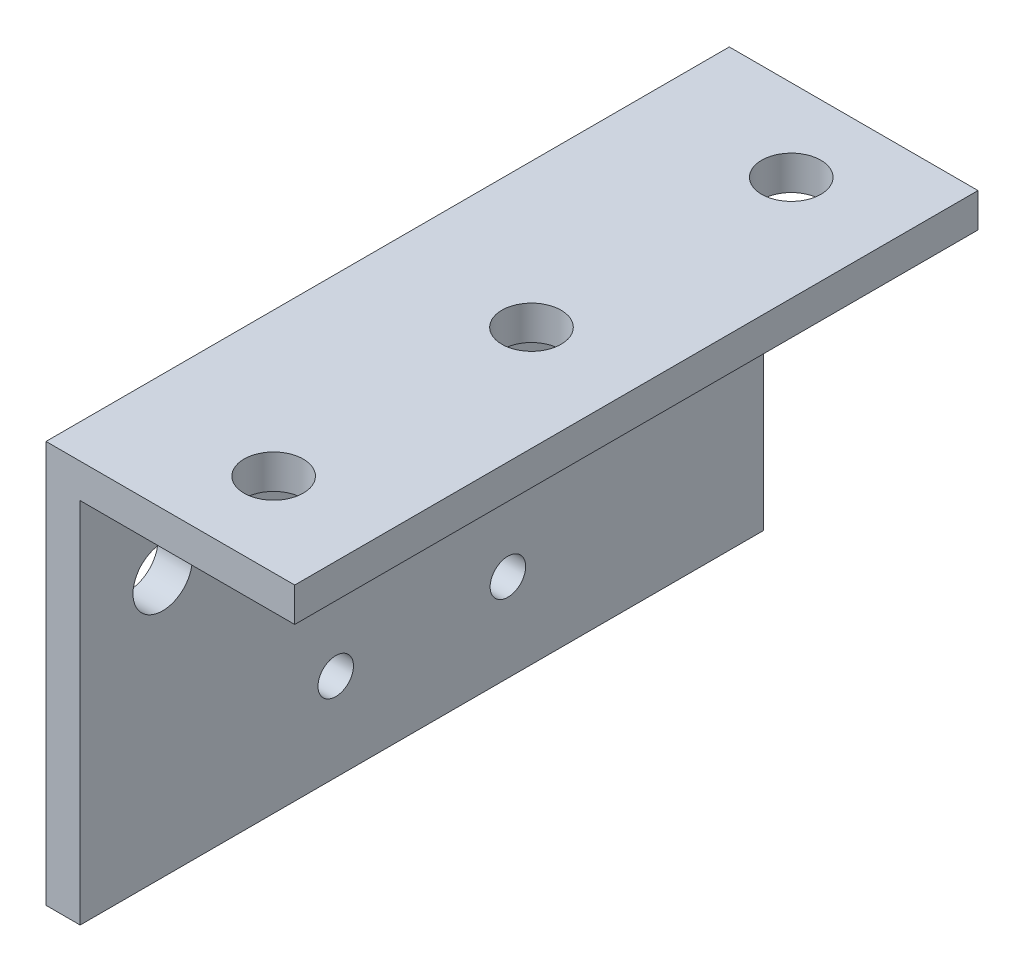
ISO-10303-21;
HEADER;
FILE_DESCRIPTION(('STEP AP214'),'2;1');
FILE_NAME('part.step','',(''),(''),'','','');
FILE_SCHEMA(('AUTOMOTIVE_DESIGN { 1 0 10303 214 1 1 1 1 }'));
ENDSEC;
DATA;
#1=APPLICATION_CONTEXT('core data for automotive mechanical design processes');
#2=APPLICATION_PROTOCOL_DEFINITION('international standard','automotive_design',2000,#1);
#3=PRODUCT_CONTEXT('',#1,'mechanical');
#4=PRODUCT('Part','Part','',(#3));
#5=PRODUCT_RELATED_PRODUCT_CATEGORY('part','',(#4));
#6=PRODUCT_DEFINITION_FORMATION('','',#4);
#7=PRODUCT_DEFINITION_CONTEXT('part definition',#1,'design');
#8=PRODUCT_DEFINITION('design','',#6,#7);
#9=PRODUCT_DEFINITION_SHAPE('','',#8);
#10=(LENGTH_UNIT() NAMED_UNIT(*) SI_UNIT(.MILLI.,.METRE.));
#11=(NAMED_UNIT(*) PLANE_ANGLE_UNIT() SI_UNIT($,.RADIAN.));
#12=(NAMED_UNIT(*) SI_UNIT($,.STERADIAN.) SOLID_ANGLE_UNIT());
#13=UNCERTAINTY_MEASURE_WITH_UNIT(LENGTH_MEASURE(1.E-05),#10,'distance_accuracy_value','');
#14=(GEOMETRIC_REPRESENTATION_CONTEXT(3) GLOBAL_UNCERTAINTY_ASSIGNED_CONTEXT((#13)) GLOBAL_UNIT_ASSIGNED_CONTEXT((#10,
#11,#12)) REPRESENTATION_CONTEXT('',''));
#15=CARTESIAN_POINT('',(0.,0.,0.));
#16=DIRECTION('',(0.,0.,1.));
#17=DIRECTION('',(1.,0.,0.));
#18=AXIS2_PLACEMENT_3D('',#15,#16,#17);
#19=CARTESIAN_POINT('',(0.,0.,63.5));
#20=DIRECTION('',(0.,1.,0.));
#21=DIRECTION('',(0.,0.,1.));
#22=AXIS2_PLACEMENT_3D('',#19,#20,#21);
#23=PLANE('',#22);
#24=DIRECTION('',(1.,0.,0.));
#25=VECTOR('',#24,1.);
#26=CARTESIAN_POINT('',(0.,0.,0.));
#27=LINE('',#26,#25);
#28=CARTESIAN_POINT('',(0.,0.,0.));
#29=VERTEX_POINT('',#28);
#30=CARTESIAN_POINT('',(3.175,0.,0.));
#31=VERTEX_POINT('',#30);
#32=EDGE_CURVE('E129',#29,#31,#27,.T.);
#33=ORIENTED_EDGE('',*,*,#32,.T.);
#34=DIRECTION('',(0.,0.,-1.));
#35=VECTOR('',#34,1.);
#36=CARTESIAN_POINT('',(3.175,0.,63.5));
#37=LINE('',#36,#35);
#38=CARTESIAN_POINT('',(3.175,0.,63.5));
#39=VERTEX_POINT('',#38);
#40=EDGE_CURVE('E11',#39,#31,#37,.T.);
#41=ORIENTED_EDGE('',*,*,#40,.F.);
#42=DIRECTION('',(1.,0.,0.));
#43=VECTOR('',#42,1.);
#44=CARTESIAN_POINT('',(0.,0.,63.5));
#45=LINE('',#44,#43);
#46=CARTESIAN_POINT('',(0.,0.,63.5));
#47=VERTEX_POINT('',#46);
#48=EDGE_CURVE('E140',#47,#39,#45,.T.);
#49=ORIENTED_EDGE('',*,*,#48,.F.);
#50=DIRECTION('',(0.,0.,-1.));
#51=VECTOR('',#50,1.);
#52=CARTESIAN_POINT('',(0.,0.,63.5));
#53=LINE('',#52,#51);
#54=EDGE_CURVE('E125',#47,#29,#53,.T.);
#55=ORIENTED_EDGE('',*,*,#54,.T.);
#56=EDGE_LOOP('',(#33,#41,#49,#55));
#57=FACE_BOUND('',#56,.T.);
#58=ADVANCED_FACE('F45',(#57),#23,.F.);
#59=CARTESIAN_POINT('',(3.175,0.,63.5));
#60=DIRECTION('',(-1.,0.,0.));
#61=DIRECTION('',(0.,0.,1.));
#62=AXIS2_PLACEMENT_3D('',#59,#60,#61);
#63=PLANE('',#62);
#64=CARTESIAN_POINT('',(3.175,24.163,23.75));
#65=DIRECTION('',(-1.,0.,0.));
#66=DIRECTION('',(0.,0.,1.));
#67=AXIS2_PLACEMENT_3D('',#64,#65,#66);
#68=CIRCLE('',#67,1.64999999999999);
#69=CARTESIAN_POINT('',(3.175,24.163,25.4));
#70=VERTEX_POINT('',#69);
#71=EDGE_CURVE('E298',#70,#70,#68,.T.);
#72=ORIENTED_EDGE('',*,*,#71,.T.);
#73=EDGE_LOOP('',(#72));
#74=FACE_BOUND('',#73,.T.);
#75=CARTESIAN_POINT('',(3.175,8.16299999999999,23.75));
#76=DIRECTION('',(-1.,0.,0.));
#77=DIRECTION('',(0.,0.,1.));
#78=AXIS2_PLACEMENT_3D('',#75,#76,#77);
#79=CIRCLE('',#78,1.64999999999999);
#80=CARTESIAN_POINT('',(3.175,8.16299999999999,25.4));
#81=VERTEX_POINT('',#80);
#82=EDGE_CURVE('E302',#81,#81,#79,.T.);
#83=ORIENTED_EDGE('',*,*,#82,.T.);
#84=EDGE_LOOP('',(#83));
#85=FACE_BOUND('',#84,.T.);
#86=CARTESIAN_POINT('',(3.175,8.16299999999999,39.75));
#87=DIRECTION('',(-1.,0.,0.));
#88=DIRECTION('',(0.,0.,1.));
#89=AXIS2_PLACEMENT_3D('',#86,#87,#88);
#90=CIRCLE('',#89,1.64999999999999);
#91=CARTESIAN_POINT('',(3.175,8.16299999999999,41.4));
#92=VERTEX_POINT('',#91);
#93=EDGE_CURVE('E311',#92,#92,#90,.T.);
#94=ORIENTED_EDGE('',*,*,#93,.T.);
#95=EDGE_LOOP('',(#94));
#96=FACE_BOUND('',#95,.T.);
#97=CARTESIAN_POINT('',(3.175,24.163,39.75));
#98=DIRECTION('',(-1.,0.,0.));
#99=DIRECTION('',(0.,0.,1.));
#100=AXIS2_PLACEMENT_3D('',#97,#98,#99);
#101=CIRCLE('',#100,1.64999999999999);
#102=CARTESIAN_POINT('',(3.175,24.163,41.4));
#103=VERTEX_POINT('',#102);
#104=EDGE_CURVE('E317',#103,#103,#101,.T.);
#105=ORIENTED_EDGE('',*,*,#104,.T.);
#106=EDGE_LOOP('',(#105));
#107=FACE_BOUND('',#106,.T.);
#108=CARTESIAN_POINT('',(3.175,24.2082215193958,7.6776384833819));
#109=DIRECTION('',(-1.,0.,0.));
#110=DIRECTION('',(0.,0.,1.));
#111=AXIS2_PLACEMENT_3D('',#108,#109,#110);
#112=CIRCLE('',#111,2.75);
#113=CARTESIAN_POINT('',(3.175,24.2082215193958,10.4276384833819));
#114=VERTEX_POINT('',#113);
#115=EDGE_CURVE('E341',#114,#114,#112,.T.);
#116=ORIENTED_EDGE('',*,*,#115,.T.);
#117=EDGE_LOOP('',(#116));
#118=FACE_BOUND('',#117,.T.);
#119=CARTESIAN_POINT('',(3.175,24.2082215193958,55.8413474799005));
#120=DIRECTION('',(-1.,0.,0.));
#121=DIRECTION('',(0.,0.,1.));
#122=AXIS2_PLACEMENT_3D('',#119,#120,#121);
#123=CIRCLE('',#122,2.75);
#124=CARTESIAN_POINT('',(3.175,24.2082215193958,58.5913474799005));
#125=VERTEX_POINT('',#124);
#126=EDGE_CURVE('E133',#125,#125,#123,.T.);
#127=ORIENTED_EDGE('',*,*,#126,.T.);
#128=EDGE_LOOP('',(#127));
#129=FACE_BOUND('',#128,.T.);
#130=DIRECTION('',(0.,1.,0.));
#131=VECTOR('',#130,1.);
#132=CARTESIAN_POINT('',(3.175,0.,0.));
#133=LINE('',#132,#131);
#134=CARTESIAN_POINT('',(3.175,34.163,0.));
#135=VERTEX_POINT('',#134);
#136=EDGE_CURVE('E132',#31,#135,#133,.T.);
#137=ORIENTED_EDGE('',*,*,#136,.T.);
#138=DIRECTION('',(0.,0.,-1.));
#139=VECTOR('',#138,1.);
#140=CARTESIAN_POINT('',(3.175,34.163,63.5));
#141=LINE('',#140,#139);
#142=CARTESIAN_POINT('',(3.175,34.163,63.5));
#143=VERTEX_POINT('',#142);
#144=EDGE_CURVE('E53',#143,#135,#141,.T.);
#145=ORIENTED_EDGE('',*,*,#144,.F.);
#146=DIRECTION('',(0.,1.,0.));
#147=VECTOR('',#146,1.);
#148=CARTESIAN_POINT('',(3.175,0.,63.5));
#149=LINE('',#148,#147);
#150=EDGE_CURVE('E98',#39,#143,#149,.T.);
#151=ORIENTED_EDGE('',*,*,#150,.F.);
#152=ORIENTED_EDGE('',*,*,#40,.T.);
#153=EDGE_LOOP('',(#137,#145,#151,#152));
#154=FACE_BOUND('',#153,.T.);
#155=ADVANCED_FACE('F170',(#74,#85,#96,#107,#118,#129,#154),#63,.F.);
#156=CARTESIAN_POINT('',(3.175,34.163,63.5));
#157=DIRECTION('',(0.,1.,0.));
#158=DIRECTION('',(0.,0.,1.));
#159=AXIS2_PLACEMENT_3D('',#156,#157,#158);
#160=PLANE('',#159);
#161=CARTESIAN_POINT('',(13.3685820866548,34.163,7.61064961564513));
#162=DIRECTION('',(0.,1.,0.));
#163=DIRECTION('',(0.,0.,1.));
#164=AXIS2_PLACEMENT_3D('',#161,#162,#163);
#165=CIRCLE('',#164,2.74999999999999);
#166=CARTESIAN_POINT('',(13.3685820866548,34.163,10.3606496156451));
#167=VERTEX_POINT('',#166);
#168=EDGE_CURVE('E323',#167,#167,#165,.T.);
#169=ORIENTED_EDGE('',*,*,#168,.T.);
#170=EDGE_LOOP('',(#169));
#171=FACE_BOUND('',#170,.T.);
#172=CARTESIAN_POINT('',(13.3685820866548,34.163,55.7136932764438));
#173=DIRECTION('',(0.,1.,0.));
#174=DIRECTION('',(0.,0.,1.));
#175=AXIS2_PLACEMENT_3D('',#172,#173,#174);
#176=CIRCLE('',#175,2.74999999999999);
#177=CARTESIAN_POINT('',(13.3685820866548,34.163,58.4636932764438));
#178=VERTEX_POINT('',#177);
#179=EDGE_CURVE('E329',#178,#178,#176,.T.);
#180=ORIENTED_EDGE('',*,*,#179,.T.);
#181=EDGE_LOOP('',(#180));
#182=FACE_BOUND('',#181,.T.);
#183=CARTESIAN_POINT('',(13.3685820866548,34.163,31.75));
#184=DIRECTION('',(0.,1.,0.));
#185=DIRECTION('',(0.,0.,1.));
#186=AXIS2_PLACEMENT_3D('',#183,#184,#185);
#187=CIRCLE('',#186,2.74999999999999);
#188=CARTESIAN_POINT('',(13.3685820866548,34.163,34.5));
#189=VERTEX_POINT('',#188);
#190=EDGE_CURVE('E335',#189,#189,#187,.T.);
#191=ORIENTED_EDGE('',*,*,#190,.T.);
#192=EDGE_LOOP('',(#191));
#193=FACE_BOUND('',#192,.T.);
#194=DIRECTION('',(1.,0.,0.));
#195=VECTOR('',#194,1.);
#196=CARTESIAN_POINT('',(3.175,34.163,0.));
#197=LINE('',#196,#195);
#198=CARTESIAN_POINT('',(23.114,34.163,0.));
#199=VERTEX_POINT('',#198);
#200=EDGE_CURVE('E135',#135,#199,#197,.T.);
#201=ORIENTED_EDGE('',*,*,#200,.T.);
#202=DIRECTION('',(0.,0.,-1.));
#203=VECTOR('',#202,1.);
#204=CARTESIAN_POINT('',(23.114,34.163,63.5));
#205=LINE('',#204,#203);
#206=CARTESIAN_POINT('',(23.114,34.163,63.5));
#207=VERTEX_POINT('',#206);
#208=EDGE_CURVE('E120',#207,#199,#205,.T.);
#209=ORIENTED_EDGE('',*,*,#208,.F.);
#210=DIRECTION('',(1.,0.,0.));
#211=VECTOR('',#210,1.);
#212=CARTESIAN_POINT('',(3.175,34.163,63.5));
#213=LINE('',#212,#211);
#214=EDGE_CURVE('E111',#143,#207,#213,.T.);
#215=ORIENTED_EDGE('',*,*,#214,.F.);
#216=ORIENTED_EDGE('',*,*,#144,.T.);
#217=EDGE_LOOP('',(#201,#209,#215,#216));
#218=FACE_BOUND('',#217,.T.);
#219=ADVANCED_FACE('F146',(#171,#182,#193,#218),#160,.F.);
#220=CARTESIAN_POINT('',(23.114,37.338,63.5));
#221=DIRECTION('',(-1.,0.,0.));
#222=DIRECTION('',(0.,-1.,0.));
#223=AXIS2_PLACEMENT_3D('',#220,#221,#222);
#224=PLANE('',#223);
#225=DIRECTION('',(0.,1.,0.));
#226=VECTOR('',#225,1.);
#227=CARTESIAN_POINT('',(23.114,37.338,0.));
#228=LINE('',#227,#226);
#229=CARTESIAN_POINT('',(23.114,37.338,0.));
#230=VERTEX_POINT('',#229);
#231=EDGE_CURVE('E119',#199,#230,#228,.T.);
#232=ORIENTED_EDGE('',*,*,#231,.T.);
#233=DIRECTION('',(0.,0.,-1.));
#234=VECTOR('',#233,1.);
#235=CARTESIAN_POINT('',(23.114,37.338,63.5));
#236=LINE('',#235,#234);
#237=CARTESIAN_POINT('',(23.114,37.338,63.5));
#238=VERTEX_POINT('',#237);
#239=EDGE_CURVE('E116',#238,#230,#236,.T.);
#240=ORIENTED_EDGE('',*,*,#239,.F.);
#241=DIRECTION('',(0.,1.,0.));
#242=VECTOR('',#241,1.);
#243=CARTESIAN_POINT('',(23.114,37.338,63.5));
#244=LINE('',#243,#242);
#245=EDGE_CURVE('E105',#207,#238,#244,.T.);
#246=ORIENTED_EDGE('',*,*,#245,.F.);
#247=ORIENTED_EDGE('',*,*,#208,.T.);
#248=EDGE_LOOP('',(#232,#240,#246,#247));
#249=FACE_BOUND('',#248,.T.);
#250=ADVANCED_FACE('F117',(#249),#224,.F.);
#251=CARTESIAN_POINT('',(0.,37.338,63.5));
#252=DIRECTION('',(0.,-1.,0.));
#253=DIRECTION('',(0.,0.,-1.));
#254=AXIS2_PLACEMENT_3D('',#251,#252,#253);
#255=PLANE('',#254);
#256=CARTESIAN_POINT('',(13.3685820866548,37.338,7.61064961564513));
#257=DIRECTION('',(0.,1.,0.));
#258=DIRECTION('',(0.,0.,1.));
#259=AXIS2_PLACEMENT_3D('',#256,#257,#258);
#260=CIRCLE('',#259,2.75);
#261=CARTESIAN_POINT('',(13.3685820866548,37.338,10.3606496156451));
#262=VERTEX_POINT('',#261);
#263=EDGE_CURVE('E320',#262,#262,#260,.T.);
#264=ORIENTED_EDGE('',*,*,#263,.F.);
#265=EDGE_LOOP('',(#264));
#266=FACE_BOUND('',#265,.T.);
#267=CARTESIAN_POINT('',(13.3685820866548,37.338,55.7136932764438));
#268=DIRECTION('',(0.,1.,0.));
#269=DIRECTION('',(0.,0.,1.));
#270=AXIS2_PLACEMENT_3D('',#267,#268,#269);
#271=CIRCLE('',#270,2.75);
#272=CARTESIAN_POINT('',(13.3685820866548,37.338,58.4636932764438));
#273=VERTEX_POINT('',#272);
#274=EDGE_CURVE('E326',#273,#273,#271,.T.);
#275=ORIENTED_EDGE('',*,*,#274,.F.);
#276=EDGE_LOOP('',(#275));
#277=FACE_BOUND('',#276,.T.);
#278=CARTESIAN_POINT('',(13.3685820866548,37.338,31.75));
#279=DIRECTION('',(0.,1.,0.));
#280=DIRECTION('',(0.,0.,1.));
#281=AXIS2_PLACEMENT_3D('',#278,#279,#280);
#282=CIRCLE('',#281,2.75);
#283=CARTESIAN_POINT('',(13.3685820866548,37.338,34.5));
#284=VERTEX_POINT('',#283);
#285=EDGE_CURVE('E332',#284,#284,#282,.T.);
#286=ORIENTED_EDGE('',*,*,#285,.F.);
#287=EDGE_LOOP('',(#286));
#288=FACE_BOUND('',#287,.T.);
#289=DIRECTION('',(-1.,0.,0.));
#290=VECTOR('',#289,1.);
#291=CARTESIAN_POINT('',(0.,37.338,0.));
#292=LINE('',#291,#290);
#293=CARTESIAN_POINT('',(0.,37.338,0.));
#294=VERTEX_POINT('',#293);
#295=EDGE_CURVE('E84',#230,#294,#292,.T.);
#296=ORIENTED_EDGE('',*,*,#295,.T.);
#297=DIRECTION('',(0.,0.,-1.));
#298=VECTOR('',#297,1.);
#299=CARTESIAN_POINT('',(0.,37.338,63.5));
#300=LINE('',#299,#298);
#301=CARTESIAN_POINT('',(0.,37.338,63.5));
#302=VERTEX_POINT('',#301);
#303=EDGE_CURVE('E121',#302,#294,#300,.T.);
#304=ORIENTED_EDGE('',*,*,#303,.F.);
#305=DIRECTION('',(-1.,0.,0.));
#306=VECTOR('',#305,1.);
#307=CARTESIAN_POINT('',(0.,37.338,63.5));
#308=LINE('',#307,#306);
#309=EDGE_CURVE('E109',#238,#302,#308,.T.);
#310=ORIENTED_EDGE('',*,*,#309,.F.);
#311=ORIENTED_EDGE('',*,*,#239,.T.);
#312=EDGE_LOOP('',(#296,#304,#310,#311));
#313=FACE_BOUND('',#312,.T.);
#314=ADVANCED_FACE('F123',(#266,#277,#288,#313),#255,.F.);
#315=CARTESIAN_POINT('',(0.,0.,63.5));
#316=DIRECTION('',(1.,0.,0.));
#317=DIRECTION('',(0.,0.,-1.));
#318=AXIS2_PLACEMENT_3D('',#315,#316,#317);
#319=PLANE('',#318);
#320=CARTESIAN_POINT('',(0.,24.163,23.75));
#321=DIRECTION('',(-1.,0.,0.));
#322=DIRECTION('',(0.,0.,1.));
#323=AXIS2_PLACEMENT_3D('',#320,#321,#322);
#324=CIRCLE('',#323,1.64999999999999);
#325=CARTESIAN_POINT('',(0.,24.163,25.4));
#326=VERTEX_POINT('',#325);
#327=EDGE_CURVE('E296',#326,#326,#324,.T.);
#328=ORIENTED_EDGE('',*,*,#327,.F.);
#329=EDGE_LOOP('',(#328));
#330=FACE_BOUND('',#329,.T.);
#331=CARTESIAN_POINT('',(0.,8.16299999999999,23.75));
#332=DIRECTION('',(-1.,0.,0.));
#333=DIRECTION('',(0.,0.,1.));
#334=AXIS2_PLACEMENT_3D('',#331,#332,#333);
#335=CIRCLE('',#334,1.64999999999999);
#336=CARTESIAN_POINT('',(0.,8.16299999999999,25.4));
#337=VERTEX_POINT('',#336);
#338=EDGE_CURVE('E299',#337,#337,#335,.T.);
#339=ORIENTED_EDGE('',*,*,#338,.F.);
#340=EDGE_LOOP('',(#339));
#341=FACE_BOUND('',#340,.T.);
#342=CARTESIAN_POINT('',(0.,8.16299999999999,39.75));
#343=DIRECTION('',(-1.,0.,0.));
#344=DIRECTION('',(0.,0.,1.));
#345=AXIS2_PLACEMENT_3D('',#342,#343,#344);
#346=CIRCLE('',#345,1.64999999999999);
#347=CARTESIAN_POINT('',(0.,8.16299999999999,41.4));
#348=VERTEX_POINT('',#347);
#349=EDGE_CURVE('E308',#348,#348,#346,.T.);
#350=ORIENTED_EDGE('',*,*,#349,.F.);
#351=EDGE_LOOP('',(#350));
#352=FACE_BOUND('',#351,.T.);
#353=CARTESIAN_POINT('',(0.,24.163,39.75));
#354=DIRECTION('',(-1.,0.,0.));
#355=DIRECTION('',(0.,0.,1.));
#356=AXIS2_PLACEMENT_3D('',#353,#354,#355);
#357=CIRCLE('',#356,1.64999999999999);
#358=CARTESIAN_POINT('',(0.,24.163,41.4));
#359=VERTEX_POINT('',#358);
#360=EDGE_CURVE('E314',#359,#359,#357,.T.);
#361=ORIENTED_EDGE('',*,*,#360,.F.);
#362=EDGE_LOOP('',(#361));
#363=FACE_BOUND('',#362,.T.);
#364=CARTESIAN_POINT('',(0.,24.2082215193958,7.6776384833819));
#365=DIRECTION('',(-1.,0.,0.));
#366=DIRECTION('',(0.,0.,1.));
#367=AXIS2_PLACEMENT_3D('',#364,#365,#366);
#368=CIRCLE('',#367,2.75);
#369=CARTESIAN_POINT('',(0.,24.2082215193958,10.4276384833819));
#370=VERTEX_POINT('',#369);
#371=EDGE_CURVE('E338',#370,#370,#368,.T.);
#372=ORIENTED_EDGE('',*,*,#371,.F.);
#373=EDGE_LOOP('',(#372));
#374=FACE_BOUND('',#373,.T.);
#375=CARTESIAN_POINT('',(0.,24.2082215193958,55.8413474799005));
#376=DIRECTION('',(-1.,0.,0.));
#377=DIRECTION('',(0.,0.,1.));
#378=AXIS2_PLACEMENT_3D('',#375,#376,#377);
#379=CIRCLE('',#378,2.75);
#380=CARTESIAN_POINT('',(0.,24.2082215193958,58.5913474799005));
#381=VERTEX_POINT('',#380);
#382=EDGE_CURVE('E344',#381,#381,#379,.T.);
#383=ORIENTED_EDGE('',*,*,#382,.F.);
#384=EDGE_LOOP('',(#383));
#385=FACE_BOUND('',#384,.T.);
#386=DIRECTION('',(0.,-1.,0.));
#387=VECTOR('',#386,1.);
#388=CARTESIAN_POINT('',(0.,0.,0.));
#389=LINE('',#388,#387);
#390=EDGE_CURVE('E90',#294,#29,#389,.T.);
#391=ORIENTED_EDGE('',*,*,#390,.T.);
#392=ORIENTED_EDGE('',*,*,#54,.F.);
#393=DIRECTION('',(0.,-1.,0.));
#394=VECTOR('',#393,1.);
#395=CARTESIAN_POINT('',(0.,0.,63.5));
#396=LINE('',#395,#394);
#397=EDGE_CURVE('E61',#302,#47,#396,.T.);
#398=ORIENTED_EDGE('',*,*,#397,.F.);
#399=ORIENTED_EDGE('',*,*,#303,.T.);
#400=EDGE_LOOP('',(#391,#392,#398,#399));
#401=FACE_BOUND('',#400,.T.);
#402=ADVANCED_FACE('F153',(#330,#341,#352,#363,#374,#385,#401),#319,.F.);
#403=CARTESIAN_POINT('',(0.,0.,63.5));
#404=DIRECTION('',(0.,0.,1.));
#405=DIRECTION('',(1.,0.,0.));
#406=AXIS2_PLACEMENT_3D('',#403,#404,#405);
#407=PLANE('',#406);
#408=ORIENTED_EDGE('',*,*,#48,.T.);
#409=ORIENTED_EDGE('',*,*,#150,.T.);
#410=ORIENTED_EDGE('',*,*,#214,.T.);
#411=ORIENTED_EDGE('',*,*,#245,.T.);
#412=ORIENTED_EDGE('',*,*,#309,.T.);
#413=ORIENTED_EDGE('',*,*,#397,.T.);
#414=EDGE_LOOP('',(#408,#409,#410,#411,#412,#413));
#415=FACE_BOUND('',#414,.T.);
#416=ADVANCED_FACE('F107',(#415),#407,.T.);
#417=CARTESIAN_POINT('',(0.,0.,0.));
#418=DIRECTION('',(0.,0.,1.));
#419=DIRECTION('',(1.,0.,0.));
#420=AXIS2_PLACEMENT_3D('',#417,#418,#419);
#421=PLANE('',#420);
#422=ORIENTED_EDGE('',*,*,#32,.F.);
#423=ORIENTED_EDGE('',*,*,#390,.F.);
#424=ORIENTED_EDGE('',*,*,#295,.F.);
#425=ORIENTED_EDGE('',*,*,#231,.F.);
#426=ORIENTED_EDGE('',*,*,#200,.F.);
#427=ORIENTED_EDGE('',*,*,#136,.F.);
#428=EDGE_LOOP('',(#422,#423,#424,#425,#426,#427));
#429=FACE_BOUND('',#428,.T.);
#430=ADVANCED_FACE('F149',(#429),#421,.F.);
#431=CARTESIAN_POINT('',(0.,24.2082215193958,55.8413474799005));
#432=DIRECTION('',(-1.,0.,0.));
#433=DIRECTION('',(0.,0.,1.));
#434=AXIS2_PLACEMENT_3D('',#431,#432,#433);
#435=CYLINDRICAL_SURFACE('',#434,2.75);
#436=ORIENTED_EDGE('',*,*,#382,.T.);
#437=EDGE_LOOP('',(#436));
#438=FACE_BOUND('',#437,.T.);
#439=ORIENTED_EDGE('',*,*,#126,.F.);
#440=EDGE_LOOP('',(#439));
#441=FACE_BOUND('',#440,.T.);
#442=ADVANCED_FACE('F200',(#438,#441),#435,.F.);
#443=CARTESIAN_POINT('',(0.,24.2082215193958,7.6776384833819));
#444=DIRECTION('',(-1.,0.,0.));
#445=DIRECTION('',(0.,0.,1.));
#446=AXIS2_PLACEMENT_3D('',#443,#444,#445);
#447=CYLINDRICAL_SURFACE('',#446,2.75);
#448=ORIENTED_EDGE('',*,*,#371,.T.);
#449=EDGE_LOOP('',(#448));
#450=FACE_BOUND('',#449,.T.);
#451=ORIENTED_EDGE('',*,*,#115,.F.);
#452=EDGE_LOOP('',(#451));
#453=FACE_BOUND('',#452,.T.);
#454=ADVANCED_FACE('F207',(#450,#453),#447,.F.);
#455=CARTESIAN_POINT('',(13.3685820866548,37.338,31.75));
#456=DIRECTION('',(0.,1.,0.));
#457=DIRECTION('',(0.,0.,1.));
#458=AXIS2_PLACEMENT_3D('',#455,#456,#457);
#459=CYLINDRICAL_SURFACE('',#458,2.74999999999999);
#460=ORIENTED_EDGE('',*,*,#285,.T.);
#461=EDGE_LOOP('',(#460));
#462=FACE_BOUND('',#461,.T.);
#463=ORIENTED_EDGE('',*,*,#190,.F.);
#464=EDGE_LOOP('',(#463));
#465=FACE_BOUND('',#464,.T.);
#466=ADVANCED_FACE('F216',(#462,#465),#459,.F.);
#467=CARTESIAN_POINT('',(13.3685820866548,37.338,55.7136932764438));
#468=DIRECTION('',(0.,1.,0.));
#469=DIRECTION('',(0.,0.,1.));
#470=AXIS2_PLACEMENT_3D('',#467,#468,#469);
#471=CYLINDRICAL_SURFACE('',#470,2.74999999999999);
#472=ORIENTED_EDGE('',*,*,#274,.T.);
#473=EDGE_LOOP('',(#472));
#474=FACE_BOUND('',#473,.T.);
#475=ORIENTED_EDGE('',*,*,#179,.F.);
#476=EDGE_LOOP('',(#475));
#477=FACE_BOUND('',#476,.T.);
#478=ADVANCED_FACE('F225',(#474,#477),#471,.F.);
#479=CARTESIAN_POINT('',(13.3685820866548,37.338,7.61064961564513));
#480=DIRECTION('',(0.,1.,0.));
#481=DIRECTION('',(0.,0.,1.));
#482=AXIS2_PLACEMENT_3D('',#479,#480,#481);
#483=CYLINDRICAL_SURFACE('',#482,2.74999999999999);
#484=ORIENTED_EDGE('',*,*,#263,.T.);
#485=EDGE_LOOP('',(#484));
#486=FACE_BOUND('',#485,.T.);
#487=ORIENTED_EDGE('',*,*,#168,.F.);
#488=EDGE_LOOP('',(#487));
#489=FACE_BOUND('',#488,.T.);
#490=ADVANCED_FACE('F233',(#486,#489),#483,.F.);
#491=CARTESIAN_POINT('',(0.,24.163,39.75));
#492=DIRECTION('',(-1.,0.,0.));
#493=DIRECTION('',(0.,0.,1.));
#494=AXIS2_PLACEMENT_3D('',#491,#492,#493);
#495=CYLINDRICAL_SURFACE('',#494,1.64999999999999);
#496=ORIENTED_EDGE('',*,*,#360,.T.);
#497=EDGE_LOOP('',(#496));
#498=FACE_BOUND('',#497,.T.);
#499=ORIENTED_EDGE('',*,*,#104,.F.);
#500=EDGE_LOOP('',(#499));
#501=FACE_BOUND('',#500,.T.);
#502=ADVANCED_FACE('F249',(#498,#501),#495,.F.);
#503=CARTESIAN_POINT('',(0.,8.16299999999999,39.75));
#504=DIRECTION('',(-1.,0.,0.));
#505=DIRECTION('',(0.,0.,1.));
#506=AXIS2_PLACEMENT_3D('',#503,#504,#505);
#507=CYLINDRICAL_SURFACE('',#506,1.64999999999999);
#508=ORIENTED_EDGE('',*,*,#349,.T.);
#509=EDGE_LOOP('',(#508));
#510=FACE_BOUND('',#509,.T.);
#511=ORIENTED_EDGE('',*,*,#93,.F.);
#512=EDGE_LOOP('',(#511));
#513=FACE_BOUND('',#512,.T.);
#514=ADVANCED_FACE('F261',(#510,#513),#507,.F.);
#515=CARTESIAN_POINT('',(0.,8.16299999999999,23.75));
#516=DIRECTION('',(-1.,0.,0.));
#517=DIRECTION('',(0.,0.,1.));
#518=AXIS2_PLACEMENT_3D('',#515,#516,#517);
#519=CYLINDRICAL_SURFACE('',#518,1.64999999999999);
#520=ORIENTED_EDGE('',*,*,#338,.T.);
#521=EDGE_LOOP('',(#520));
#522=FACE_BOUND('',#521,.T.);
#523=ORIENTED_EDGE('',*,*,#82,.F.);
#524=EDGE_LOOP('',(#523));
#525=FACE_BOUND('',#524,.T.);
#526=ADVANCED_FACE('F271',(#522,#525),#519,.F.);
#527=CARTESIAN_POINT('',(0.,24.163,23.75));
#528=DIRECTION('',(-1.,0.,0.));
#529=DIRECTION('',(0.,0.,1.));
#530=AXIS2_PLACEMENT_3D('',#527,#528,#529);
#531=CYLINDRICAL_SURFACE('',#530,1.64999999999999);
#532=ORIENTED_EDGE('',*,*,#327,.T.);
#533=EDGE_LOOP('',(#532));
#534=FACE_BOUND('',#533,.T.);
#535=ORIENTED_EDGE('',*,*,#71,.F.);
#536=EDGE_LOOP('',(#535));
#537=FACE_BOUND('',#536,.T.);
#538=ADVANCED_FACE('F281',(#534,#537),#531,.F.);
#539=CLOSED_SHELL('',(#58,#155,#219,#250,#314,#402,#416,#430,#442,#454,#466,#478,#490,#502,#514,
#526,#538));
#540=MANIFOLD_SOLID_BREP('B2',#539);
#541=ADVANCED_BREP_SHAPE_REPRESENTATION('',(#18,#540),#14);
#542=SHAPE_DEFINITION_REPRESENTATION(#9,#541);
ENDSEC;
END-ISO-10303-21;
